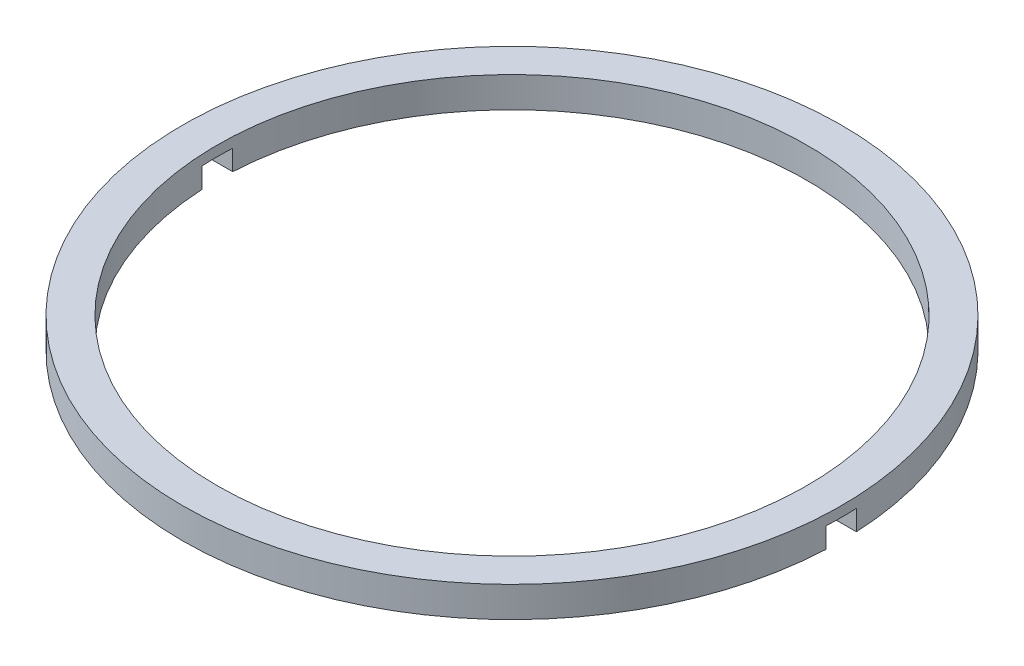
ISO-10303-21;
HEADER;
FILE_DESCRIPTION(('STEP AP214'),'2;1');
FILE_NAME('part.step','',(''),(''),'','','');
FILE_SCHEMA(('AUTOMOTIVE_DESIGN { 1 0 10303 214 1 1 1 1 }'));
ENDSEC;
DATA;
#1=APPLICATION_CONTEXT('core data for automotive mechanical design processes');
#2=APPLICATION_PROTOCOL_DEFINITION('international standard','automotive_design',2000,#1);
#3=PRODUCT_CONTEXT('',#1,'mechanical');
#4=PRODUCT('Part','Part','',(#3));
#5=PRODUCT_RELATED_PRODUCT_CATEGORY('part','',(#4));
#6=PRODUCT_DEFINITION_FORMATION('','',#4);
#7=PRODUCT_DEFINITION_CONTEXT('part definition',#1,'design');
#8=PRODUCT_DEFINITION('design','',#6,#7);
#9=PRODUCT_DEFINITION_SHAPE('','',#8);
#10=(LENGTH_UNIT() NAMED_UNIT(*) SI_UNIT(.MILLI.,.METRE.));
#11=(NAMED_UNIT(*) PLANE_ANGLE_UNIT() SI_UNIT($,.RADIAN.));
#12=(NAMED_UNIT(*) SI_UNIT($,.STERADIAN.) SOLID_ANGLE_UNIT());
#13=UNCERTAINTY_MEASURE_WITH_UNIT(LENGTH_MEASURE(1.E-05),#10,'distance_accuracy_value','');
#14=(GEOMETRIC_REPRESENTATION_CONTEXT(3) GLOBAL_UNCERTAINTY_ASSIGNED_CONTEXT((#13)) GLOBAL_UNIT_ASSIGNED_CONTEXT((#10,
#11,#12)) REPRESENTATION_CONTEXT('',''));
#15=CARTESIAN_POINT('',(0.,0.,0.));
#16=DIRECTION('',(0.,0.,1.));
#17=DIRECTION('',(1.,0.,0.));
#18=AXIS2_PLACEMENT_3D('',#15,#16,#17);
#19=CARTESIAN_POINT('',(0.,0.,0.));
#20=DIRECTION('',(0.,1.,0.));
#21=DIRECTION('',(0.,0.,1.));
#22=AXIS2_PLACEMENT_3D('',#19,#20,#21);
#23=PLANE('',#22);
#24=CARTESIAN_POINT('',(0.,0.,0.));
#25=DIRECTION('',(0.,1.,0.));
#26=DIRECTION('',(0.,0.,1.));
#27=AXIS2_PLACEMENT_3D('',#24,#25,#26);
#28=CIRCLE('',#27,3.24);
#29=CARTESIAN_POINT('',(-3.23652591523689,0.,0.15));
#30=VERTEX_POINT('',#29);
#31=CARTESIAN_POINT('',(3.23652591523689,0.,0.15));
#32=VERTEX_POINT('',#31);
#33=EDGE_CURVE('E127',#30,#32,#28,.T.);
#34=ORIENTED_EDGE('',*,*,#33,.F.);
#35=DIRECTION('',(-1.,0.,0.));
#36=VECTOR('',#35,1.);
#37=CARTESIAN_POINT('',(-3.77508317578212,0.,0.15));
#38=LINE('',#37,#36);
#39=CARTESIAN_POINT('',(-2.89611809151492,0.,0.15));
#40=VERTEX_POINT('',#39);
#41=EDGE_CURVE('E119',#40,#30,#38,.T.);
#42=ORIENTED_EDGE('',*,*,#41,.F.);
#43=CARTESIAN_POINT('',(0.,0.,0.));
#44=DIRECTION('',(0.,-1.,0.));
#45=DIRECTION('',(0.,0.,-1.));
#46=AXIS2_PLACEMENT_3D('',#43,#44,#45);
#47=CIRCLE('',#46,2.9);
#48=CARTESIAN_POINT('',(2.89611809151492,0.,0.15));
#49=VERTEX_POINT('',#48);
#50=EDGE_CURVE('E158',#49,#40,#47,.T.);
#51=ORIENTED_EDGE('',*,*,#50,.F.);
#52=EDGE_CURVE('E172',#32,#49,#38,.T.);
#53=ORIENTED_EDGE('',*,*,#52,.F.);
#54=EDGE_LOOP('',(#34,#42,#51,#53));
#55=FACE_BOUND('',#54,.T.);
#56=ADVANCED_FACE('F36',(#55),#23,.F.);
#57=CARTESIAN_POINT('',(0.,0.3,0.));
#58=DIRECTION('',(0.,-1.,0.));
#59=DIRECTION('',(0.,0.,-1.));
#60=AXIS2_PLACEMENT_3D('',#57,#58,#59);
#61=CYLINDRICAL_SURFACE('',#60,3.24);
#62=ORIENTED_EDGE('',*,*,#33,.T.);
#63=DIRECTION('',(0.,-1.,0.));
#64=VECTOR('',#63,1.);
#65=CARTESIAN_POINT('',(3.23652591523689,0.3,0.15));
#66=LINE('',#65,#64);
#67=CARTESIAN_POINT('',(3.23652591523689,0.2,0.15));
#68=VERTEX_POINT('',#67);
#69=EDGE_CURVE('E166',#32,#68,#66,.F.);
#70=ORIENTED_EDGE('',*,*,#69,.T.);
#71=CARTESIAN_POINT('',(0.,0.2,0.));
#72=DIRECTION('',(0.,-1.,0.));
#73=DIRECTION('',(0.,0.,-1.));
#74=AXIS2_PLACEMENT_3D('',#71,#72,#73);
#75=CIRCLE('',#74,3.24);
#76=CARTESIAN_POINT('',(3.23652591523689,0.2,-0.15));
#77=VERTEX_POINT('',#76);
#78=EDGE_CURVE('E109',#77,#68,#75,.T.);
#79=ORIENTED_EDGE('',*,*,#78,.F.);
#80=DIRECTION('',(0.,-1.,0.));
#81=VECTOR('',#80,1.);
#82=CARTESIAN_POINT('',(3.23652591523689,0.3,-0.15));
#83=LINE('',#82,#81);
#84=CARTESIAN_POINT('',(3.23652591523689,0.,-0.15));
#85=VERTEX_POINT('',#84);
#86=EDGE_CURVE('E108',#77,#85,#83,.T.);
#87=ORIENTED_EDGE('',*,*,#86,.T.);
#88=CARTESIAN_POINT('',(-3.23652591523689,0.,-0.15));
#89=VERTEX_POINT('',#88);
#90=EDGE_CURVE('E116',#85,#89,#28,.T.);
#91=ORIENTED_EDGE('',*,*,#90,.T.);
#92=DIRECTION('',(0.,-1.,0.));
#93=VECTOR('',#92,1.);
#94=CARTESIAN_POINT('',(-3.23652591523689,0.3,-0.15));
#95=LINE('',#94,#93);
#96=CARTESIAN_POINT('',(-3.23652591523689,0.2,-0.15));
#97=VERTEX_POINT('',#96);
#98=EDGE_CURVE('E100',#89,#97,#95,.F.);
#99=ORIENTED_EDGE('',*,*,#98,.T.);
#100=CARTESIAN_POINT('',(-3.23652591523689,0.2,0.15));
#101=VERTEX_POINT('',#100);
#102=EDGE_CURVE('E170',#101,#97,#75,.T.);
#103=ORIENTED_EDGE('',*,*,#102,.F.);
#104=DIRECTION('',(0.,-1.,0.));
#105=VECTOR('',#104,1.);
#106=CARTESIAN_POINT('',(-3.23652591523689,0.3,0.15));
#107=LINE('',#106,#105);
#108=EDGE_CURVE('E152',#101,#30,#107,.T.);
#109=ORIENTED_EDGE('',*,*,#108,.T.);
#110=EDGE_LOOP('',(#62,#70,#79,#87,#91,#99,#103,#109));
#111=FACE_BOUND('',#110,.T.);
#112=CARTESIAN_POINT('',(0.,0.3,0.));
#113=DIRECTION('',(0.,1.,0.));
#114=DIRECTION('',(0.,0.,1.));
#115=AXIS2_PLACEMENT_3D('',#112,#113,#114);
#116=CIRCLE('',#115,3.24);
#117=CARTESIAN_POINT('',(0.,0.3,3.24));
#118=VERTEX_POINT('',#117);
#119=EDGE_CURVE('E126',#118,#118,#116,.T.);
#120=ORIENTED_EDGE('',*,*,#119,.F.);
#121=EDGE_LOOP('',(#120));
#122=FACE_BOUND('',#121,.T.);
#123=ADVANCED_FACE('F38',(#111,#122),#61,.T.);
#124=CARTESIAN_POINT('',(0.,0.3,0.));
#125=DIRECTION('',(0.,1.,0.));
#126=DIRECTION('',(0.,0.,1.));
#127=AXIS2_PLACEMENT_3D('',#124,#125,#126);
#128=PLANE('',#127);
#129=CARTESIAN_POINT('',(0.,0.3,0.));
#130=DIRECTION('',(0.,1.,0.));
#131=DIRECTION('',(0.,0.,1.));
#132=AXIS2_PLACEMENT_3D('',#129,#130,#131);
#133=CIRCLE('',#132,2.9);
#134=CARTESIAN_POINT('',(0.,0.3,2.9));
#135=VERTEX_POINT('',#134);
#136=EDGE_CURVE('E132',#135,#135,#133,.T.);
#137=ORIENTED_EDGE('',*,*,#136,.F.);
#138=EDGE_LOOP('',(#137));
#139=FACE_BOUND('',#138,.T.);
#140=ORIENTED_EDGE('',*,*,#119,.T.);
#141=EDGE_LOOP('',(#140));
#142=FACE_BOUND('',#141,.T.);
#143=ADVANCED_FACE('F197',(#139,#142),#128,.T.);
#144=ORIENTED_EDGE('',*,*,#90,.F.);
#145=DIRECTION('',(1.,0.,0.));
#146=VECTOR('',#145,1.);
#147=CARTESIAN_POINT('',(-3.77508317578212,0.,-0.15));
#148=LINE('',#147,#146);
#149=CARTESIAN_POINT('',(2.89611809151492,0.,-0.15));
#150=VERTEX_POINT('',#149);
#151=EDGE_CURVE('E120',#150,#85,#148,.T.);
#152=ORIENTED_EDGE('',*,*,#151,.F.);
#153=CARTESIAN_POINT('',(-2.89611809151492,0.,-0.15));
#154=VERTEX_POINT('',#153);
#155=EDGE_CURVE('E118',#154,#150,#47,.T.);
#156=ORIENTED_EDGE('',*,*,#155,.F.);
#157=EDGE_CURVE('E103',#89,#154,#148,.T.);
#158=ORIENTED_EDGE('',*,*,#157,.F.);
#159=EDGE_LOOP('',(#144,#152,#156,#158));
#160=FACE_BOUND('',#159,.T.);
#161=ADVANCED_FACE('F114',(#160),#23,.F.);
#162=CARTESIAN_POINT('',(0.,0.6,0.));
#163=DIRECTION('',(0.,-1.,0.));
#164=DIRECTION('',(0.,0.,-1.));
#165=AXIS2_PLACEMENT_3D('',#162,#163,#164);
#166=CYLINDRICAL_SURFACE('',#165,2.9);
#167=ORIENTED_EDGE('',*,*,#50,.T.);
#168=DIRECTION('',(0.,-1.,0.));
#169=VECTOR('',#168,1.);
#170=CARTESIAN_POINT('',(-2.89611809151492,0.6,0.15));
#171=LINE('',#170,#169);
#172=CARTESIAN_POINT('',(-2.89611809151492,0.2,0.15));
#173=VERTEX_POINT('',#172);
#174=EDGE_CURVE('E11',#40,#173,#171,.F.);
#175=ORIENTED_EDGE('',*,*,#174,.T.);
#176=CARTESIAN_POINT('',(0.,0.2,0.));
#177=DIRECTION('',(0.,-1.,0.));
#178=DIRECTION('',(0.,0.,-1.));
#179=AXIS2_PLACEMENT_3D('',#176,#177,#178);
#180=CIRCLE('',#179,2.9);
#181=CARTESIAN_POINT('',(-2.89611809151492,0.2,-0.15));
#182=VERTEX_POINT('',#181);
#183=EDGE_CURVE('E137',#182,#173,#180,.F.);
#184=ORIENTED_EDGE('',*,*,#183,.F.);
#185=DIRECTION('',(0.,-1.,0.));
#186=VECTOR('',#185,1.);
#187=CARTESIAN_POINT('',(-2.89611809151492,0.6,-0.15));
#188=LINE('',#187,#186);
#189=EDGE_CURVE('E44',#182,#154,#188,.T.);
#190=ORIENTED_EDGE('',*,*,#189,.T.);
#191=ORIENTED_EDGE('',*,*,#155,.T.);
#192=DIRECTION('',(0.,-1.,0.));
#193=VECTOR('',#192,1.);
#194=CARTESIAN_POINT('',(2.89611809151492,0.6,-0.15));
#195=LINE('',#194,#193);
#196=CARTESIAN_POINT('',(2.89611809151492,0.2,-0.15));
#197=VERTEX_POINT('',#196);
#198=EDGE_CURVE('E136',#150,#197,#195,.F.);
#199=ORIENTED_EDGE('',*,*,#198,.T.);
#200=CARTESIAN_POINT('',(2.89611809151492,0.2,0.15));
#201=VERTEX_POINT('',#200);
#202=EDGE_CURVE('E130',#201,#197,#180,.F.);
#203=ORIENTED_EDGE('',*,*,#202,.F.);
#204=DIRECTION('',(0.,-1.,0.));
#205=VECTOR('',#204,1.);
#206=CARTESIAN_POINT('',(2.89611809151492,0.6,0.15));
#207=LINE('',#206,#205);
#208=EDGE_CURVE('E140',#201,#49,#207,.T.);
#209=ORIENTED_EDGE('',*,*,#208,.T.);
#210=EDGE_LOOP('',(#167,#175,#184,#190,#191,#199,#203,#209));
#211=FACE_BOUND('',#210,.T.);
#212=ORIENTED_EDGE('',*,*,#136,.T.);
#213=EDGE_LOOP('',(#212));
#214=FACE_BOUND('',#213,.T.);
#215=ADVANCED_FACE('F155',(#211,#214),#166,.F.);
#216=CARTESIAN_POINT('',(0.,0.2,0.));
#217=DIRECTION('',(0.,-1.,0.));
#218=DIRECTION('',(0.,0.,-1.));
#219=AXIS2_PLACEMENT_3D('',#216,#217,#218);
#220=PLANE('',#219);
#221=ORIENTED_EDGE('',*,*,#78,.T.);
#222=DIRECTION('',(-1.,0.,0.));
#223=VECTOR('',#222,1.);
#224=CARTESIAN_POINT('',(-3.77508317578212,0.2,0.15));
#225=LINE('',#224,#223);
#226=EDGE_CURVE('E59',#68,#201,#225,.T.);
#227=ORIENTED_EDGE('',*,*,#226,.T.);
#228=ORIENTED_EDGE('',*,*,#202,.T.);
#229=DIRECTION('',(1.,0.,0.));
#230=VECTOR('',#229,1.);
#231=CARTESIAN_POINT('',(-3.77508317578212,0.2,-0.15));
#232=LINE('',#231,#230);
#233=EDGE_CURVE('E174',#197,#77,#232,.T.);
#234=ORIENTED_EDGE('',*,*,#233,.T.);
#235=EDGE_LOOP('',(#221,#227,#228,#234));
#236=FACE_BOUND('',#235,.T.);
#237=ADVANCED_FACE('F180',(#236),#220,.T.);
#238=CARTESIAN_POINT('',(-3.77508317578212,0.2,-0.15));
#239=DIRECTION('',(0.,0.,-1.));
#240=DIRECTION('',(-1.,0.,0.));
#241=AXIS2_PLACEMENT_3D('',#238,#239,#240);
#242=PLANE('',#241);
#243=ORIENTED_EDGE('',*,*,#233,.F.);
#244=ORIENTED_EDGE('',*,*,#198,.F.);
#245=ORIENTED_EDGE('',*,*,#151,.T.);
#246=ORIENTED_EDGE('',*,*,#86,.F.);
#247=EDGE_LOOP('',(#243,#244,#245,#246));
#248=FACE_BOUND('',#247,.T.);
#249=ADVANCED_FACE('F182',(#248),#242,.F.);
#250=CARTESIAN_POINT('',(-3.77508317578212,0.2,0.15));
#251=DIRECTION('',(0.,0.,1.));
#252=DIRECTION('',(1.,0.,0.));
#253=AXIS2_PLACEMENT_3D('',#250,#251,#252);
#254=PLANE('',#253);
#255=ORIENTED_EDGE('',*,*,#52,.T.);
#256=ORIENTED_EDGE('',*,*,#208,.F.);
#257=ORIENTED_EDGE('',*,*,#226,.F.);
#258=ORIENTED_EDGE('',*,*,#69,.F.);
#259=EDGE_LOOP('',(#255,#256,#257,#258));
#260=FACE_BOUND('',#259,.T.);
#261=ADVANCED_FACE('F178',(#260),#254,.F.);
#262=EDGE_CURVE('E147',#173,#101,#225,.T.);
#263=ORIENTED_EDGE('',*,*,#262,.F.);
#264=ORIENTED_EDGE('',*,*,#174,.F.);
#265=ORIENTED_EDGE('',*,*,#41,.T.);
#266=ORIENTED_EDGE('',*,*,#108,.F.);
#267=EDGE_LOOP('',(#263,#264,#265,#266));
#268=FACE_BOUND('',#267,.T.);
#269=ADVANCED_FACE('F149',(#268),#254,.F.);
#270=ORIENTED_EDGE('',*,*,#157,.T.);
#271=ORIENTED_EDGE('',*,*,#189,.F.);
#272=EDGE_CURVE('E51',#97,#182,#232,.T.);
#273=ORIENTED_EDGE('',*,*,#272,.F.);
#274=ORIENTED_EDGE('',*,*,#98,.F.);
#275=EDGE_LOOP('',(#270,#271,#273,#274));
#276=FACE_BOUND('',#275,.T.);
#277=ADVANCED_FACE('F102',(#276),#242,.F.);
#278=ORIENTED_EDGE('',*,*,#102,.T.);
#279=ORIENTED_EDGE('',*,*,#272,.T.);
#280=ORIENTED_EDGE('',*,*,#183,.T.);
#281=ORIENTED_EDGE('',*,*,#262,.T.);
#282=EDGE_LOOP('',(#278,#279,#280,#281));
#283=FACE_BOUND('',#282,.T.);
#284=ADVANCED_FACE('F146',(#283),#220,.T.);
#285=CLOSED_SHELL('',(#56,#123,#143,#161,#215,#237,#249,#261,#269,#277,#284));
#286=MANIFOLD_SOLID_BREP('B2',#285);
#287=ADVANCED_BREP_SHAPE_REPRESENTATION('',(#18,#286),#14);
#288=SHAPE_DEFINITION_REPRESENTATION(#9,#287);
ENDSEC;
END-ISO-10303-21;
